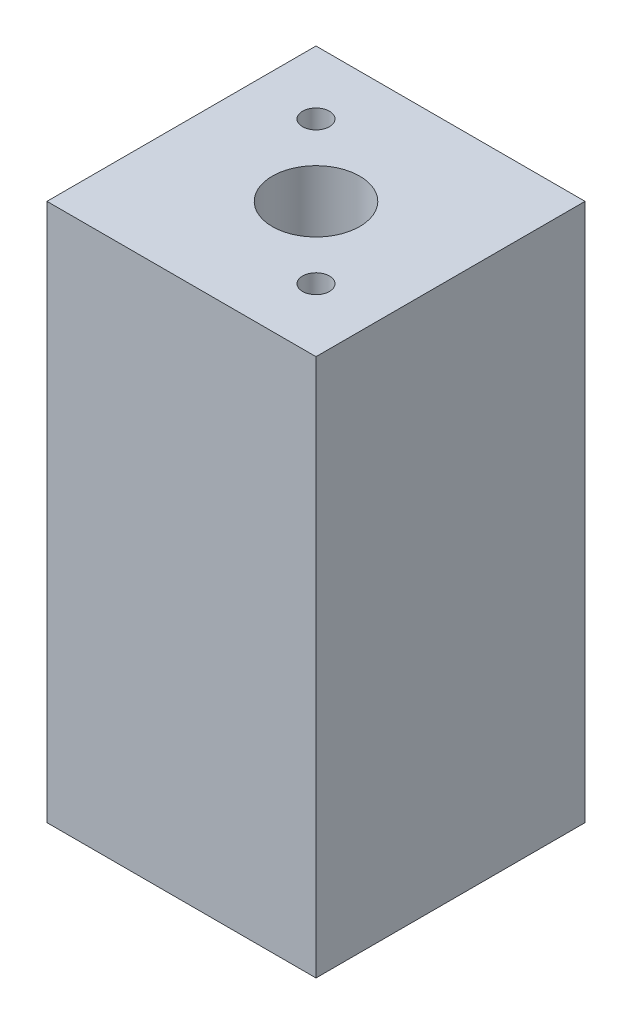
ISO-10303-21;
HEADER;
FILE_DESCRIPTION(('STEP AP214'),'2;1');
FILE_NAME('part.step','',(''),(''),'','','');
FILE_SCHEMA(('AUTOMOTIVE_DESIGN { 1 0 10303 214 1 1 1 1 }'));
ENDSEC;
DATA;
#1=APPLICATION_CONTEXT('core data for automotive mechanical design processes');
#2=APPLICATION_PROTOCOL_DEFINITION('international standard','automotive_design',2000,#1);
#3=PRODUCT_CONTEXT('',#1,'mechanical');
#4=PRODUCT('Part','Part','',(#3));
#5=PRODUCT_RELATED_PRODUCT_CATEGORY('part','',(#4));
#6=PRODUCT_DEFINITION_FORMATION('','',#4);
#7=PRODUCT_DEFINITION_CONTEXT('part definition',#1,'design');
#8=PRODUCT_DEFINITION('design','',#6,#7);
#9=PRODUCT_DEFINITION_SHAPE('','',#8);
#10=(LENGTH_UNIT() NAMED_UNIT(*) SI_UNIT(.MILLI.,.METRE.));
#11=(NAMED_UNIT(*) PLANE_ANGLE_UNIT() SI_UNIT($,.RADIAN.));
#12=(NAMED_UNIT(*) SI_UNIT($,.STERADIAN.) SOLID_ANGLE_UNIT());
#13=UNCERTAINTY_MEASURE_WITH_UNIT(LENGTH_MEASURE(1.E-05),#10,'distance_accuracy_value','');
#14=(GEOMETRIC_REPRESENTATION_CONTEXT(3) GLOBAL_UNCERTAINTY_ASSIGNED_CONTEXT((#13)) GLOBAL_UNIT_ASSIGNED_CONTEXT((#10,
#11,#12)) REPRESENTATION_CONTEXT('',''));
#15=CARTESIAN_POINT('',(0.,0.,0.));
#16=DIRECTION('',(0.,0.,1.));
#17=DIRECTION('',(1.,0.,0.));
#18=AXIS2_PLACEMENT_3D('',#15,#16,#17);
#19=CARTESIAN_POINT('',(10.,-40.,10.));
#20=DIRECTION('',(1.,0.,0.));
#21=DIRECTION('',(0.,0.,-1.));
#22=AXIS2_PLACEMENT_3D('',#19,#20,#21);
#23=PLANE('',#22);
#24=DIRECTION('',(0.,0.,-1.));
#25=VECTOR('',#24,1.);
#26=CARTESIAN_POINT('',(10.,0.,10.));
#27=LINE('',#26,#25);
#28=CARTESIAN_POINT('',(10.,0.,10.));
#29=VERTEX_POINT('',#28);
#30=CARTESIAN_POINT('',(10.,0.,-10.));
#31=VERTEX_POINT('',#30);
#32=EDGE_CURVE('E97',#29,#31,#27,.T.);
#33=ORIENTED_EDGE('',*,*,#32,.F.);
#34=DIRECTION('',(0.,1.,0.));
#35=VECTOR('',#34,1.);
#36=CARTESIAN_POINT('',(10.,-40.,10.));
#37=LINE('',#36,#35);
#38=CARTESIAN_POINT('',(10.,-40.,10.));
#39=VERTEX_POINT('',#38);
#40=EDGE_CURVE('E11',#39,#29,#37,.T.);
#41=ORIENTED_EDGE('',*,*,#40,.F.);
#42=DIRECTION('',(0.,0.,-1.));
#43=VECTOR('',#42,1.);
#44=CARTESIAN_POINT('',(10.,-40.,10.));
#45=LINE('',#44,#43);
#46=CARTESIAN_POINT('',(10.,-40.,-10.));
#47=VERTEX_POINT('',#46);
#48=EDGE_CURVE('E90',#39,#47,#45,.T.);
#49=ORIENTED_EDGE('',*,*,#48,.T.);
#50=DIRECTION('',(0.,1.,0.));
#51=VECTOR('',#50,1.);
#52=CARTESIAN_POINT('',(10.,-40.,-10.));
#53=LINE('',#52,#51);
#54=EDGE_CURVE('E35',#47,#31,#53,.T.);
#55=ORIENTED_EDGE('',*,*,#54,.T.);
#56=EDGE_LOOP('',(#33,#41,#49,#55));
#57=FACE_BOUND('',#56,.T.);
#58=ADVANCED_FACE('F32',(#57),#23,.T.);
#59=CARTESIAN_POINT('',(-10.,-40.,10.));
#60=DIRECTION('',(0.,0.,1.));
#61=DIRECTION('',(1.,0.,0.));
#62=AXIS2_PLACEMENT_3D('',#59,#60,#61);
#63=PLANE('',#62);
#64=DIRECTION('',(1.,0.,0.));
#65=VECTOR('',#64,1.);
#66=CARTESIAN_POINT('',(-10.,0.,10.));
#67=LINE('',#66,#65);
#68=CARTESIAN_POINT('',(-10.,0.,10.));
#69=VERTEX_POINT('',#68);
#70=EDGE_CURVE('E92',#69,#29,#67,.T.);
#71=ORIENTED_EDGE('',*,*,#70,.F.);
#72=DIRECTION('',(0.,1.,0.));
#73=VECTOR('',#72,1.);
#74=CARTESIAN_POINT('',(-10.,-40.,10.));
#75=LINE('',#74,#73);
#76=CARTESIAN_POINT('',(-10.,-40.,10.));
#77=VERTEX_POINT('',#76);
#78=EDGE_CURVE('E41',#77,#69,#75,.T.);
#79=ORIENTED_EDGE('',*,*,#78,.F.);
#80=DIRECTION('',(1.,0.,0.));
#81=VECTOR('',#80,1.);
#82=CARTESIAN_POINT('',(-10.,-40.,10.));
#83=LINE('',#82,#81);
#84=EDGE_CURVE('E87',#77,#39,#83,.T.);
#85=ORIENTED_EDGE('',*,*,#84,.T.);
#86=ORIENTED_EDGE('',*,*,#40,.T.);
#87=EDGE_LOOP('',(#71,#79,#85,#86));
#88=FACE_BOUND('',#87,.T.);
#89=ADVANCED_FACE('F108',(#88),#63,.T.);
#90=CARTESIAN_POINT('',(-10.,-40.,10.));
#91=DIRECTION('',(-1.,0.,0.));
#92=DIRECTION('',(0.,0.,1.));
#93=AXIS2_PLACEMENT_3D('',#90,#91,#92);
#94=PLANE('',#93);
#95=DIRECTION('',(0.,0.,1.));
#96=VECTOR('',#95,1.);
#97=CARTESIAN_POINT('',(-10.,0.,10.));
#98=LINE('',#97,#96);
#99=CARTESIAN_POINT('',(-10.,0.,-10.));
#100=VERTEX_POINT('',#99);
#101=EDGE_CURVE('E82',#100,#69,#98,.T.);
#102=ORIENTED_EDGE('',*,*,#101,.F.);
#103=DIRECTION('',(0.,1.,0.));
#104=VECTOR('',#103,1.);
#105=CARTESIAN_POINT('',(-10.,-40.,-10.));
#106=LINE('',#105,#104);
#107=CARTESIAN_POINT('',(-10.,-40.,-10.));
#108=VERTEX_POINT('',#107);
#109=EDGE_CURVE('E77',#108,#100,#106,.T.);
#110=ORIENTED_EDGE('',*,*,#109,.F.);
#111=DIRECTION('',(0.,0.,1.));
#112=VECTOR('',#111,1.);
#113=CARTESIAN_POINT('',(-10.,-40.,10.));
#114=LINE('',#113,#112);
#115=EDGE_CURVE('E80',#108,#77,#114,.T.);
#116=ORIENTED_EDGE('',*,*,#115,.T.);
#117=ORIENTED_EDGE('',*,*,#78,.T.);
#118=EDGE_LOOP('',(#102,#110,#116,#117));
#119=FACE_BOUND('',#118,.T.);
#120=ADVANCED_FACE('F79',(#119),#94,.T.);
#121=CARTESIAN_POINT('',(-10.,-40.,-10.));
#122=DIRECTION('',(0.,0.,-1.));
#123=DIRECTION('',(-1.,0.,0.));
#124=AXIS2_PLACEMENT_3D('',#121,#122,#123);
#125=PLANE('',#124);
#126=DIRECTION('',(-1.,0.,0.));
#127=VECTOR('',#126,1.);
#128=CARTESIAN_POINT('',(-10.,0.,-10.));
#129=LINE('',#128,#127);
#130=EDGE_CURVE('E100',#31,#100,#129,.T.);
#131=ORIENTED_EDGE('',*,*,#130,.F.);
#132=ORIENTED_EDGE('',*,*,#54,.F.);
#133=DIRECTION('',(-1.,0.,0.));
#134=VECTOR('',#133,1.);
#135=CARTESIAN_POINT('',(-10.,-40.,-10.));
#136=LINE('',#135,#134);
#137=EDGE_CURVE('E86',#47,#108,#136,.T.);
#138=ORIENTED_EDGE('',*,*,#137,.T.);
#139=ORIENTED_EDGE('',*,*,#109,.T.);
#140=EDGE_LOOP('',(#131,#132,#138,#139));
#141=FACE_BOUND('',#140,.T.);
#142=ADVANCED_FACE('F89',(#141),#125,.T.);
#143=CARTESIAN_POINT('',(0.,-40.,0.));
#144=DIRECTION('',(0.,-1.,0.));
#145=DIRECTION('',(0.,0.,-1.));
#146=AXIS2_PLACEMENT_3D('',#143,#144,#145);
#147=PLANE('',#146);
#148=CARTESIAN_POINT('',(0.,-40.,0.));
#149=DIRECTION('',(0.,1.,0.));
#150=DIRECTION('',(0.,0.,1.));
#151=AXIS2_PLACEMENT_3D('',#148,#149,#150);
#152=CIRCLE('',#151,3.25);
#153=CARTESIAN_POINT('',(0.,-40.,3.25));
#154=VERTEX_POINT('',#153);
#155=EDGE_CURVE('E145',#154,#154,#152,.T.);
#156=ORIENTED_EDGE('',*,*,#155,.T.);
#157=EDGE_LOOP('',(#156));
#158=FACE_BOUND('',#157,.T.);
#159=CARTESIAN_POINT('',(5.3033008588991,-40.,5.3033008588991));
#160=DIRECTION('',(0.,1.,0.));
#161=DIRECTION('',(0.,0.,-1.));
#162=AXIS2_PLACEMENT_3D('',#159,#160,#161);
#163=CIRCLE('',#162,1.);
#164=CARTESIAN_POINT('',(5.3033008588991,-40.,4.3033008588991));
#165=VERTEX_POINT('',#164);
#166=EDGE_CURVE('E153',#165,#165,#163,.T.);
#167=ORIENTED_EDGE('',*,*,#166,.T.);
#168=EDGE_LOOP('',(#167));
#169=FACE_BOUND('',#168,.T.);
#170=CARTESIAN_POINT('',(-5.30330085889911,-40.,-5.30330085889911));
#171=DIRECTION('',(0.,1.,0.));
#172=DIRECTION('',(0.,0.,1.));
#173=AXIS2_PLACEMENT_3D('',#170,#171,#172);
#174=CIRCLE('',#173,1.);
#175=CARTESIAN_POINT('',(-5.30330085889911,-40.,-4.30330085889911));
#176=VERTEX_POINT('',#175);
#177=EDGE_CURVE('E101',#176,#176,#174,.T.);
#178=ORIENTED_EDGE('',*,*,#177,.T.);
#179=EDGE_LOOP('',(#178));
#180=FACE_BOUND('',#179,.T.);
#181=ORIENTED_EDGE('',*,*,#48,.F.);
#182=ORIENTED_EDGE('',*,*,#84,.F.);
#183=ORIENTED_EDGE('',*,*,#115,.F.);
#184=ORIENTED_EDGE('',*,*,#137,.F.);
#185=EDGE_LOOP('',(#181,#182,#183,#184));
#186=FACE_BOUND('',#185,.T.);
#187=ADVANCED_FACE('F85',(#158,#169,#180,#186),#147,.T.);
#188=CARTESIAN_POINT('',(0.,0.,0.));
#189=DIRECTION('',(0.,-1.,0.));
#190=DIRECTION('',(0.,0.,-1.));
#191=AXIS2_PLACEMENT_3D('',#188,#189,#190);
#192=PLANE('',#191);
#193=CARTESIAN_POINT('',(0.,0.,0.));
#194=DIRECTION('',(0.,1.,0.));
#195=DIRECTION('',(0.,0.,1.));
#196=AXIS2_PLACEMENT_3D('',#193,#194,#195);
#197=CIRCLE('',#196,3.25);
#198=CARTESIAN_POINT('',(0.,0.,3.25));
#199=VERTEX_POINT('',#198);
#200=EDGE_CURVE('E148',#199,#199,#197,.T.);
#201=ORIENTED_EDGE('',*,*,#200,.F.);
#202=EDGE_LOOP('',(#201));
#203=FACE_BOUND('',#202,.T.);
#204=CARTESIAN_POINT('',(5.3033008588991,0.,5.3033008588991));
#205=DIRECTION('',(0.,1.,0.));
#206=DIRECTION('',(0.,0.,-1.));
#207=AXIS2_PLACEMENT_3D('',#204,#205,#206);
#208=CIRCLE('',#207,1.);
#209=CARTESIAN_POINT('',(5.3033008588991,0.,4.3033008588991));
#210=VERTEX_POINT('',#209);
#211=EDGE_CURVE('E150',#210,#210,#208,.T.);
#212=ORIENTED_EDGE('',*,*,#211,.F.);
#213=EDGE_LOOP('',(#212));
#214=FACE_BOUND('',#213,.T.);
#215=CARTESIAN_POINT('',(-5.30330085889911,0.,-5.30330085889911));
#216=DIRECTION('',(0.,1.,0.));
#217=DIRECTION('',(0.,0.,1.));
#218=AXIS2_PLACEMENT_3D('',#215,#216,#217);
#219=CIRCLE('',#218,1.);
#220=CARTESIAN_POINT('',(-5.30330085889911,0.,-4.30330085889911));
#221=VERTEX_POINT('',#220);
#222=EDGE_CURVE('E156',#221,#221,#219,.T.);
#223=ORIENTED_EDGE('',*,*,#222,.F.);
#224=EDGE_LOOP('',(#223));
#225=FACE_BOUND('',#224,.T.);
#226=ORIENTED_EDGE('',*,*,#32,.T.);
#227=ORIENTED_EDGE('',*,*,#130,.T.);
#228=ORIENTED_EDGE('',*,*,#101,.T.);
#229=ORIENTED_EDGE('',*,*,#70,.T.);
#230=EDGE_LOOP('',(#226,#227,#228,#229));
#231=FACE_BOUND('',#230,.T.);
#232=ADVANCED_FACE('F107',(#203,#214,#225,#231),#192,.F.);
#233=CARTESIAN_POINT('',(-5.30330085889911,-40.,-5.30330085889911));
#234=DIRECTION('',(0.,1.,0.));
#235=DIRECTION('',(0.,0.,1.));
#236=AXIS2_PLACEMENT_3D('',#233,#234,#235);
#237=CYLINDRICAL_SURFACE('',#236,1.);
#238=ORIENTED_EDGE('',*,*,#177,.F.);
#239=EDGE_LOOP('',(#238));
#240=FACE_BOUND('',#239,.T.);
#241=ORIENTED_EDGE('',*,*,#222,.T.);
#242=EDGE_LOOP('',(#241));
#243=FACE_BOUND('',#242,.T.);
#244=ADVANCED_FACE('F126',(#240,#243),#237,.F.);
#245=CARTESIAN_POINT('',(5.3033008588991,-40.,5.3033008588991));
#246=DIRECTION('',(0.,1.,0.));
#247=DIRECTION('',(0.,0.,1.));
#248=AXIS2_PLACEMENT_3D('',#245,#246,#247);
#249=CYLINDRICAL_SURFACE('',#248,1.);
#250=ORIENTED_EDGE('',*,*,#166,.F.);
#251=EDGE_LOOP('',(#250));
#252=FACE_BOUND('',#251,.T.);
#253=ORIENTED_EDGE('',*,*,#211,.T.);
#254=EDGE_LOOP('',(#253));
#255=FACE_BOUND('',#254,.T.);
#256=ADVANCED_FACE('F133',(#252,#255),#249,.F.);
#257=CARTESIAN_POINT('',(0.,-40.,0.));
#258=DIRECTION('',(0.,1.,0.));
#259=DIRECTION('',(0.,0.,1.));
#260=AXIS2_PLACEMENT_3D('',#257,#258,#259);
#261=CYLINDRICAL_SURFACE('',#260,3.25);
#262=ORIENTED_EDGE('',*,*,#155,.F.);
#263=EDGE_LOOP('',(#262));
#264=FACE_BOUND('',#263,.T.);
#265=ORIENTED_EDGE('',*,*,#200,.T.);
#266=EDGE_LOOP('',(#265));
#267=FACE_BOUND('',#266,.T.);
#268=ADVANCED_FACE('F137',(#264,#267),#261,.F.);
#269=CLOSED_SHELL('',(#58,#89,#120,#142,#187,#232,#244,#256,#268));
#270=MANIFOLD_SOLID_BREP('B2',#269);
#271=ADVANCED_BREP_SHAPE_REPRESENTATION('',(#18,#270),#14);
#272=SHAPE_DEFINITION_REPRESENTATION(#9,#271);
ENDSEC;
END-ISO-10303-21;
